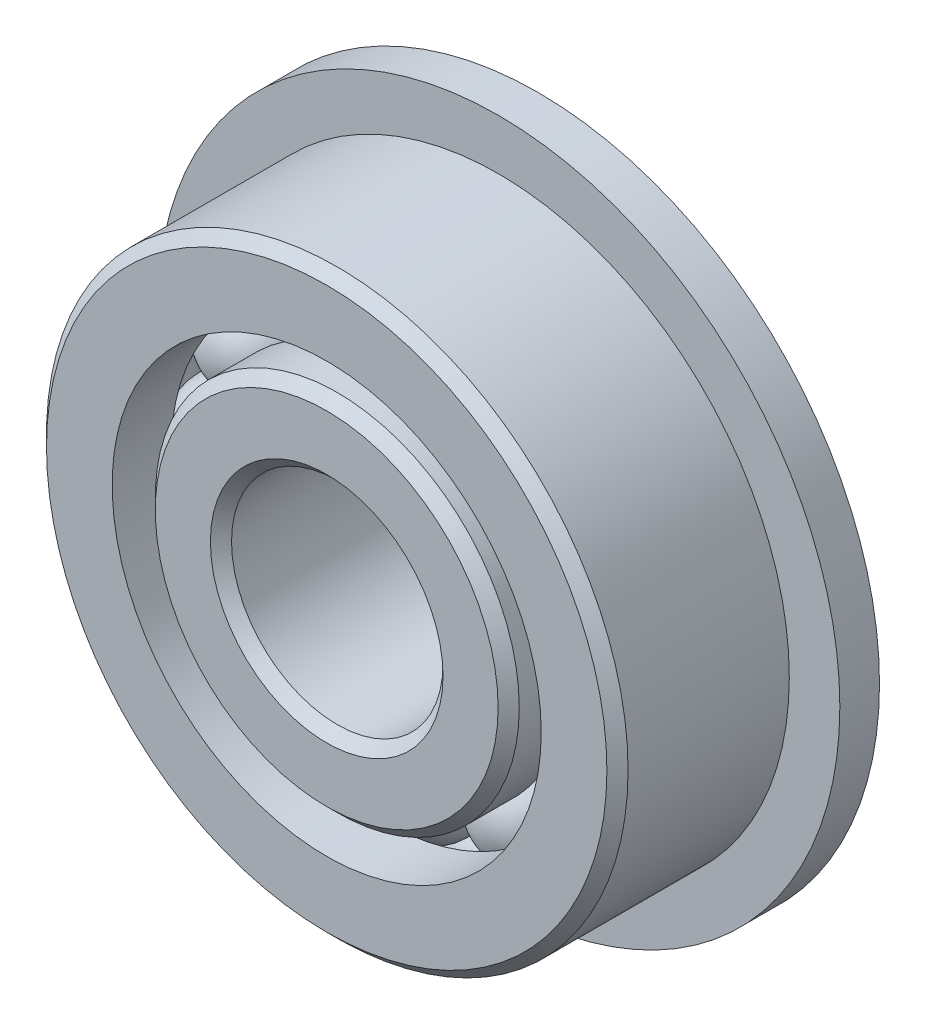
ISO-10303-21;
HEADER;
FILE_DESCRIPTION(('STEP AP214'),'2;1');
FILE_NAME('part.step','',(''),(''),'','','');
FILE_SCHEMA(('AUTOMOTIVE_DESIGN { 1 0 10303 214 1 1 1 1 }'));
ENDSEC;
DATA;
#1=APPLICATION_CONTEXT('core data for automotive mechanical design processes');
#2=APPLICATION_PROTOCOL_DEFINITION('international standard','automotive_design',2000,#1);
#3=PRODUCT_CONTEXT('',#1,'mechanical');
#4=PRODUCT('Part','Part','',(#3));
#5=PRODUCT_RELATED_PRODUCT_CATEGORY('part','',(#4));
#6=PRODUCT_DEFINITION_FORMATION('','',#4);
#7=PRODUCT_DEFINITION_CONTEXT('part definition',#1,'design');
#8=PRODUCT_DEFINITION('design','',#6,#7);
#9=PRODUCT_DEFINITION_SHAPE('','',#8);
#10=(LENGTH_UNIT() NAMED_UNIT(*) SI_UNIT(.MILLI.,.METRE.));
#11=(NAMED_UNIT(*) PLANE_ANGLE_UNIT() SI_UNIT($,.RADIAN.));
#12=(NAMED_UNIT(*) SI_UNIT($,.STERADIAN.) SOLID_ANGLE_UNIT());
#13=UNCERTAINTY_MEASURE_WITH_UNIT(LENGTH_MEASURE(1.E-05),#10,'distance_accuracy_value','');
#14=(GEOMETRIC_REPRESENTATION_CONTEXT(3) GLOBAL_UNCERTAINTY_ASSIGNED_CONTEXT((#13)) GLOBAL_UNIT_ASSIGNED_CONTEXT((#10,
#11,#12)) REPRESENTATION_CONTEXT('',''));
#15=CARTESIAN_POINT('',(0.,0.,0.));
#16=DIRECTION('',(0.,0.,1.));
#17=DIRECTION('',(1.,0.,0.));
#18=AXIS2_PLACEMENT_3D('',#15,#16,#17);
#19=CARTESIAN_POINT('',(-2.97656249999993,5.15555748190427,0.));
#20=DIRECTION('',(0.,0.,1.));
#21=DIRECTION('',(-0.499999999999989,0.866025403784445,0.));
#22=AXIS2_PLACEMENT_3D('',#19,#20,#21);
#23=SPHERICAL_SURFACE('',#22,1.4932612773582);
#24=CARTESIAN_POINT('',(-2.97656249999993,5.15555748190427,1.4932612773582));
#25=VERTEX_POINT('',#24);
#26=VERTEX_LOOP('',#25);
#27=FACE_BOUND('',#26,.T.);
#28=ADVANCED_FACE('F37',(#27),#23,.T.);
#29=CLOSED_SHELL('',(#28));
#30=MANIFOLD_SOLID_BREP('B2',#29);
#31=CARTESIAN_POINT('',(-5.1555574819042,2.97656250000006,0.));
#32=DIRECTION('',(0.,0.,1.));
#33=DIRECTION('',(-0.866025403784433,0.50000000000001,0.));
#34=AXIS2_PLACEMENT_3D('',#31,#32,#33);
#35=SPHERICAL_SURFACE('',#34,1.4932612773582);
#36=CARTESIAN_POINT('',(-5.1555574819042,2.97656250000006,1.4932612773582));
#37=VERTEX_POINT('',#36);
#38=VERTEX_LOOP('',#37);
#39=FACE_BOUND('',#38,.T.);
#40=ADVANCED_FACE('F57',(#39),#35,.T.);
#41=CLOSED_SHELL('',(#40));
#42=MANIFOLD_SOLID_BREP('B6',#41);
#43=CARTESIAN_POINT('',(-5.953125,0.,0.));
#44=DIRECTION('',(0.,0.,1.));
#45=DIRECTION('',(-1.,0.,0.));
#46=AXIS2_PLACEMENT_3D('',#43,#44,#45);
#47=SPHERICAL_SURFACE('',#46,1.4932612773582);
#48=CARTESIAN_POINT('',(-5.953125,0.,1.4932612773582));
#49=VERTEX_POINT('',#48);
#50=VERTEX_LOOP('',#49);
#51=FACE_BOUND('',#50,.T.);
#52=ADVANCED_FACE('F77',(#51),#47,.T.);
#53=CLOSED_SHELL('',(#52));
#54=MANIFOLD_SOLID_BREP('B33',#53);
#55=CARTESIAN_POINT('',(-5.15555748190426,-2.97656249999995,0.));
#56=DIRECTION('',(0.,0.,1.));
#57=DIRECTION('',(-0.866025403784443,-0.499999999999992,0.));
#58=AXIS2_PLACEMENT_3D('',#55,#56,#57);
#59=SPHERICAL_SURFACE('',#58,1.4932612773582);
#60=CARTESIAN_POINT('',(-5.15555748190426,-2.97656249999995,1.4932612773582));
#61=VERTEX_POINT('',#60);
#62=VERTEX_LOOP('',#61);
#63=FACE_BOUND('',#62,.T.);
#64=ADVANCED_FACE('F97',(#63),#59,.T.);
#65=CLOSED_SHELL('',(#64));
#66=MANIFOLD_SOLID_BREP('B53',#65);
#67=CARTESIAN_POINT('',(-2.97656250000004,-5.15555748190421,0.));
#68=DIRECTION('',(0.,0.,1.));
#69=DIRECTION('',(-0.500000000000007,-0.866025403784435,0.));
#70=AXIS2_PLACEMENT_3D('',#67,#68,#69);
#71=SPHERICAL_SURFACE('',#70,1.4932612773582);
#72=CARTESIAN_POINT('',(-2.97656250000004,-5.15555748190421,1.4932612773582));
#73=VERTEX_POINT('',#72);
#74=VERTEX_LOOP('',#73);
#75=FACE_BOUND('',#74,.T.);
#76=ADVANCED_FACE('F117',(#75),#71,.T.);
#77=CLOSED_SHELL('',(#76));
#78=MANIFOLD_SOLID_BREP('B73',#77);
#79=CARTESIAN_POINT('',(0.,-5.953125,0.));
#80=DIRECTION('',(0.,0.,1.));
#81=DIRECTION('',(0.,-1.,0.));
#82=AXIS2_PLACEMENT_3D('',#79,#80,#81);
#83=SPHERICAL_SURFACE('',#82,1.4932612773582);
#84=CARTESIAN_POINT('',(0.,-5.953125,1.4932612773582));
#85=VERTEX_POINT('',#84);
#86=VERTEX_LOOP('',#85);
#87=FACE_BOUND('',#86,.T.);
#88=ADVANCED_FACE('F137',(#87),#83,.T.);
#89=CLOSED_SHELL('',(#88));
#90=MANIFOLD_SOLID_BREP('B93',#89);
#91=CARTESIAN_POINT('',(2.97656249999997,-5.15555748190425,0.));
#92=DIRECTION('',(0.,0.,1.));
#93=DIRECTION('',(0.499999999999995,-0.866025403784442,0.));
#94=AXIS2_PLACEMENT_3D('',#91,#92,#93);
#95=SPHERICAL_SURFACE('',#94,1.4932612773582);
#96=CARTESIAN_POINT('',(2.97656249999997,-5.15555748190425,1.4932612773582));
#97=VERTEX_POINT('',#96);
#98=VERTEX_LOOP('',#97);
#99=FACE_BOUND('',#98,.T.);
#100=ADVANCED_FACE('F157',(#99),#95,.T.);
#101=CLOSED_SHELL('',(#100));
#102=MANIFOLD_SOLID_BREP('B113',#101);
#103=CARTESIAN_POINT('',(5.15555748190422,-2.97656250000002,0.));
#104=DIRECTION('',(0.,0.,1.));
#105=DIRECTION('',(0.866025403784436,-0.500000000000004,0.));
#106=AXIS2_PLACEMENT_3D('',#103,#104,#105);
#107=SPHERICAL_SURFACE('',#106,1.4932612773582);
#108=CARTESIAN_POINT('',(5.15555748190422,-2.97656250000002,1.4932612773582));
#109=VERTEX_POINT('',#108);
#110=VERTEX_LOOP('',#109);
#111=FACE_BOUND('',#110,.T.);
#112=ADVANCED_FACE('F177',(#111),#107,.T.);
#113=CLOSED_SHELL('',(#112));
#114=MANIFOLD_SOLID_BREP('B133',#113);
#115=CARTESIAN_POINT('',(5.953125,0.,0.));
#116=DIRECTION('',(0.,0.,1.));
#117=DIRECTION('',(1.,0.,0.));
#118=AXIS2_PLACEMENT_3D('',#115,#116,#117);
#119=SPHERICAL_SURFACE('',#118,1.4932612773582);
#120=CARTESIAN_POINT('',(5.953125,0.,1.4932612773582));
#121=VERTEX_POINT('',#120);
#122=VERTEX_LOOP('',#121);
#123=FACE_BOUND('',#122,.T.);
#124=ADVANCED_FACE('F197',(#123),#119,.T.);
#125=CLOSED_SHELL('',(#124));
#126=MANIFOLD_SOLID_BREP('B153',#125);
#127=CARTESIAN_POINT('',(5.15555748190424,2.97656249999999,0.));
#128=DIRECTION('',(0.,0.,1.));
#129=DIRECTION('',(0.86602540378444,0.499999999999998,0.));
#130=AXIS2_PLACEMENT_3D('',#127,#128,#129);
#131=SPHERICAL_SURFACE('',#130,1.4932612773582);
#132=CARTESIAN_POINT('',(5.15555748190424,2.97656249999999,1.4932612773582));
#133=VERTEX_POINT('',#132);
#134=VERTEX_LOOP('',#133);
#135=FACE_BOUND('',#134,.T.);
#136=ADVANCED_FACE('F217',(#135),#131,.T.);
#137=CLOSED_SHELL('',(#136));
#138=MANIFOLD_SOLID_BREP('B173',#137);
#139=CARTESIAN_POINT('',(2.97656250000001,5.15555748190423,0.));
#140=DIRECTION('',(0.,0.,1.));
#141=DIRECTION('',(0.500000000000001,0.866025403784438,0.));
#142=AXIS2_PLACEMENT_3D('',#139,#140,#141);
#143=SPHERICAL_SURFACE('',#142,1.4932612773582);
#144=CARTESIAN_POINT('',(2.97656250000001,5.15555748190423,1.4932612773582));
#145=VERTEX_POINT('',#144);
#146=VERTEX_LOOP('',#145);
#147=FACE_BOUND('',#146,.T.);
#148=ADVANCED_FACE('F237',(#147),#143,.T.);
#149=CLOSED_SHELL('',(#148));
#150=MANIFOLD_SOLID_BREP('B193',#149);
#151=CARTESIAN_POINT('',(0.,5.953125,0.));
#152=DIRECTION('',(0.,0.,1.));
#153=DIRECTION('',(0.,1.,0.));
#154=AXIS2_PLACEMENT_3D('',#151,#152,#153);
#155=SPHERICAL_SURFACE('',#154,1.4932612773582);
#156=CARTESIAN_POINT('',(0.,5.953125,1.4932612773582));
#157=VERTEX_POINT('',#156);
#158=VERTEX_LOOP('',#157);
#159=FACE_BOUND('',#158,.T.);
#160=ADVANCED_FACE('F259',(#159),#155,.T.);
#161=CLOSED_SHELL('',(#160));
#162=MANIFOLD_SOLID_BREP('B213',#161);
#163=CARTESIAN_POINT('',(0.,0.,2.8575));
#164=DIRECTION('',(0.,0.,-1.));
#165=DIRECTION('',(-1.,0.,0.));
#166=AXIS2_PLACEMENT_3D('',#163,#164,#165);
#167=CONICAL_SURFACE('',#166,5.46466346153846,0.785398163397448);
#168=CARTESIAN_POINT('',(0.,0.,3.175));
#169=DIRECTION('',(0.,0.,1.));
#170=DIRECTION('',(1.,0.,0.));
#171=AXIS2_PLACEMENT_3D('',#168,#169,#170);
#172=CIRCLE('',#171,5.14716346153846);
#173=CARTESIAN_POINT('',(5.14716346153846,0.,3.175));
#174=VERTEX_POINT('',#173);
#175=EDGE_CURVE('E312',#174,#174,#172,.T.);
#176=ORIENTED_EDGE('',*,*,#175,.F.);
#177=EDGE_LOOP('',(#176));
#178=FACE_BOUND('',#177,.T.);
#179=CARTESIAN_POINT('',(0.,0.,2.8575));
#180=DIRECTION('',(0.,0.,1.));
#181=DIRECTION('',(1.,0.,0.));
#182=AXIS2_PLACEMENT_3D('',#179,#180,#181);
#183=CIRCLE('',#182,5.46466346153846);
#184=CARTESIAN_POINT('',(5.46466346153846,0.,2.8575));
#185=VERTEX_POINT('',#184);
#186=EDGE_CURVE('E258',#185,#185,#183,.T.);
#187=ORIENTED_EDGE('',*,*,#186,.T.);
#188=EDGE_LOOP('',(#187));
#189=FACE_BOUND('',#188,.T.);
#190=ADVANCED_FACE('F278',(#178,#189),#167,.T.);
#191=CARTESIAN_POINT('',(0.,0.,3.175));
#192=DIRECTION('',(0.,0.,1.));
#193=DIRECTION('',(1.,0.,0.));
#194=AXIS2_PLACEMENT_3D('',#191,#192,#193);
#195=CYLINDRICAL_SURFACE('',#194,5.46466346153846);
#196=ORIENTED_EDGE('',*,*,#186,.F.);
#197=EDGE_LOOP('',(#196));
#198=FACE_BOUND('',#197,.T.);
#199=CARTESIAN_POINT('',(0.,0.,1.41111111111111));
#200=DIRECTION('',(0.,0.,1.));
#201=DIRECTION('',(1.,0.,0.));
#202=AXIS2_PLACEMENT_3D('',#199,#200,#201);
#203=CIRCLE('',#202,5.46466346153846);
#204=CARTESIAN_POINT('',(5.46466346153846,0.,1.41111111111111));
#205=VERTEX_POINT('',#204);
#206=EDGE_CURVE('E284',#205,#205,#203,.T.);
#207=ORIENTED_EDGE('',*,*,#206,.T.);
#208=EDGE_LOOP('',(#207));
#209=FACE_BOUND('',#208,.T.);
#210=ADVANCED_FACE('F319',(#198,#209),#195,.T.);
#211=CARTESIAN_POINT('',(0.,0.,0.));
#212=DIRECTION('',(0.,0.,1.));
#213=DIRECTION('',(1.,0.,0.));
#214=AXIS2_PLACEMENT_3D('',#211,#212,#213);
#215=TOROIDAL_SURFACE('',#214,5.953125,1.4932612773582);
#216=ORIENTED_EDGE('',*,*,#206,.F.);
#217=EDGE_LOOP('',(#216));
#218=FACE_BOUND('',#217,.T.);
#219=CARTESIAN_POINT('',(0.,0.,-1.41111111111111));
#220=DIRECTION('',(0.,0.,1.));
#221=DIRECTION('',(1.,0.,0.));
#222=AXIS2_PLACEMENT_3D('',#219,#220,#221);
#223=CIRCLE('',#222,5.46466346153846);
#224=CARTESIAN_POINT('',(5.46466346153846,0.,-1.41111111111111));
#225=VERTEX_POINT('',#224);
#226=EDGE_CURVE('E288',#225,#225,#223,.T.);
#227=ORIENTED_EDGE('',*,*,#226,.T.);
#228=EDGE_LOOP('',(#227));
#229=FACE_BOUND('',#228,.T.);
#230=ADVANCED_FACE('F323',(#218,#229),#215,.F.);
#231=CARTESIAN_POINT('',(0.,0.,3.175));
#232=DIRECTION('',(0.,0.,1.));
#233=DIRECTION('',(1.,0.,0.));
#234=AXIS2_PLACEMENT_3D('',#231,#232,#233);
#235=CYLINDRICAL_SURFACE('',#234,5.46466346153846);
#236=ORIENTED_EDGE('',*,*,#226,.F.);
#237=EDGE_LOOP('',(#236));
#238=FACE_BOUND('',#237,.T.);
#239=CARTESIAN_POINT('',(0.,0.,-4.445));
#240=DIRECTION('',(0.,0.,1.));
#241=DIRECTION('',(1.,0.,0.));
#242=AXIS2_PLACEMENT_3D('',#239,#240,#241);
#243=CIRCLE('',#242,5.46466346153846);
#244=CARTESIAN_POINT('',(5.46466346153846,0.,-4.445));
#245=VERTEX_POINT('',#244);
#246=EDGE_CURVE('E292',#245,#245,#243,.T.);
#247=ORIENTED_EDGE('',*,*,#246,.T.);
#248=EDGE_LOOP('',(#247));
#249=FACE_BOUND('',#248,.T.);
#250=ADVANCED_FACE('F328',(#238,#249),#235,.T.);
#251=CARTESIAN_POINT('',(0.,0.,-4.7625));
#252=DIRECTION('',(0.,0.,1.));
#253=DIRECTION('',(1.,0.,0.));
#254=AXIS2_PLACEMENT_3D('',#251,#252,#253);
#255=CONICAL_SURFACE('',#254,5.14716346153846,0.785398163397442);
#256=ORIENTED_EDGE('',*,*,#246,.F.);
#257=EDGE_LOOP('',(#256));
#258=FACE_BOUND('',#257,.T.);
#259=CARTESIAN_POINT('',(0.,0.,-4.7625));
#260=DIRECTION('',(0.,0.,1.));
#261=DIRECTION('',(1.,0.,0.));
#262=AXIS2_PLACEMENT_3D('',#259,#260,#261);
#263=CIRCLE('',#262,5.14716346153846);
#264=CARTESIAN_POINT('',(5.14716346153846,0.,-4.7625));
#265=VERTEX_POINT('',#264);
#266=EDGE_CURVE('E297',#265,#265,#263,.T.);
#267=ORIENTED_EDGE('',*,*,#266,.T.);
#268=EDGE_LOOP('',(#267));
#269=FACE_BOUND('',#268,.T.);
#270=ADVANCED_FACE('F334',(#258,#269),#255,.T.);
#271=CARTESIAN_POINT('',(0.,5.14716346153846,-4.7625));
#272=DIRECTION('',(0.,0.,1.));
#273=DIRECTION('',(1.,0.,0.));
#274=AXIS2_PLACEMENT_3D('',#271,#272,#273);
#275=PLANE('',#274);
#276=ORIENTED_EDGE('',*,*,#266,.F.);
#277=EDGE_LOOP('',(#276));
#278=FACE_BOUND('',#277,.T.);
#279=CARTESIAN_POINT('',(0.,0.,-4.7625));
#280=DIRECTION('',(0.,0.,1.));
#281=DIRECTION('',(1.,0.,0.));
#282=AXIS2_PLACEMENT_3D('',#279,#280,#281);
#283=CIRCLE('',#282,3.4925);
#284=CARTESIAN_POINT('',(3.4925,0.,-4.7625));
#285=VERTEX_POINT('',#284);
#286=EDGE_CURVE('E300',#285,#285,#283,.T.);
#287=ORIENTED_EDGE('',*,*,#286,.T.);
#288=EDGE_LOOP('',(#287));
#289=FACE_BOUND('',#288,.T.);
#290=ADVANCED_FACE('F338',(#278,#289),#275,.F.);
#291=CARTESIAN_POINT('',(0.,0.,-4.445));
#292=DIRECTION('',(0.,0.,-1.));
#293=DIRECTION('',(-1.,0.,0.));
#294=AXIS2_PLACEMENT_3D('',#291,#292,#293);
#295=CONICAL_SURFACE('',#294,3.175,0.785398163397445);
#296=ORIENTED_EDGE('',*,*,#286,.F.);
#297=EDGE_LOOP('',(#296));
#298=FACE_BOUND('',#297,.T.);
#299=CARTESIAN_POINT('',(0.,0.,-4.445));
#300=DIRECTION('',(0.,0.,1.));
#301=DIRECTION('',(1.,0.,0.));
#302=AXIS2_PLACEMENT_3D('',#299,#300,#301);
#303=CIRCLE('',#302,3.175);
#304=CARTESIAN_POINT('',(3.175,0.,-4.445));
#305=VERTEX_POINT('',#304);
#306=EDGE_CURVE('E303',#305,#305,#303,.T.);
#307=ORIENTED_EDGE('',*,*,#306,.T.);
#308=EDGE_LOOP('',(#307));
#309=FACE_BOUND('',#308,.T.);
#310=ADVANCED_FACE('F342',(#298,#309),#295,.F.);
#311=CARTESIAN_POINT('',(0.,0.,3.175));
#312=DIRECTION('',(0.,0.,1.));
#313=DIRECTION('',(1.,0.,0.));
#314=AXIS2_PLACEMENT_3D('',#311,#312,#313);
#315=CYLINDRICAL_SURFACE('',#314,3.175);
#316=ORIENTED_EDGE('',*,*,#306,.F.);
#317=EDGE_LOOP('',(#316));
#318=FACE_BOUND('',#317,.T.);
#319=CARTESIAN_POINT('',(0.,0.,2.8575));
#320=DIRECTION('',(0.,0.,1.));
#321=DIRECTION('',(1.,0.,0.));
#322=AXIS2_PLACEMENT_3D('',#319,#320,#321);
#323=CIRCLE('',#322,3.175);
#324=CARTESIAN_POINT('',(3.175,0.,2.8575));
#325=VERTEX_POINT('',#324);
#326=EDGE_CURVE('E306',#325,#325,#323,.T.);
#327=ORIENTED_EDGE('',*,*,#326,.T.);
#328=EDGE_LOOP('',(#327));
#329=FACE_BOUND('',#328,.T.);
#330=ADVANCED_FACE('F346',(#318,#329),#315,.F.);
#331=CARTESIAN_POINT('',(0.,0.,3.175));
#332=DIRECTION('',(0.,0.,1.));
#333=DIRECTION('',(1.,0.,0.));
#334=AXIS2_PLACEMENT_3D('',#331,#332,#333);
#335=CONICAL_SURFACE('',#334,3.4925,0.785398163397448);
#336=ORIENTED_EDGE('',*,*,#326,.F.);
#337=EDGE_LOOP('',(#336));
#338=FACE_BOUND('',#337,.T.);
#339=CARTESIAN_POINT('',(0.,0.,3.175));
#340=DIRECTION('',(0.,0.,1.));
#341=DIRECTION('',(1.,0.,0.));
#342=AXIS2_PLACEMENT_3D('',#339,#340,#341);
#343=CIRCLE('',#342,3.4925);
#344=CARTESIAN_POINT('',(3.4925,0.,3.175));
#345=VERTEX_POINT('',#344);
#346=EDGE_CURVE('E309',#345,#345,#343,.T.);
#347=ORIENTED_EDGE('',*,*,#346,.T.);
#348=EDGE_LOOP('',(#347));
#349=FACE_BOUND('',#348,.T.);
#350=ADVANCED_FACE('F350',(#338,#349),#335,.F.);
#351=CARTESIAN_POINT('',(0.,3.4925,3.175));
#352=DIRECTION('',(0.,0.,-1.));
#353=DIRECTION('',(-1.,0.,0.));
#354=AXIS2_PLACEMENT_3D('',#351,#352,#353);
#355=PLANE('',#354);
#356=ORIENTED_EDGE('',*,*,#346,.F.);
#357=EDGE_LOOP('',(#356));
#358=FACE_BOUND('',#357,.T.);
#359=ORIENTED_EDGE('',*,*,#175,.T.);
#360=EDGE_LOOP('',(#359));
#361=FACE_BOUND('',#360,.T.);
#362=ADVANCED_FACE('F316',(#358,#361),#355,.F.);
#363=CLOSED_SHELL('',(#190,#210,#230,#250,#270,#290,#310,#330,#350,#362));
#364=MANIFOLD_SOLID_BREP('B233',#363);
#365=CARTESIAN_POINT('',(0.,0.,2.8575));
#366=DIRECTION('',(0.,0.,-1.));
#367=DIRECTION('',(-1.,0.,0.));
#368=AXIS2_PLACEMENT_3D('',#365,#366,#367);
#369=CONICAL_SURFACE('',#368,8.73125,0.785398163397446);
#370=CARTESIAN_POINT('',(0.,0.,3.175));
#371=DIRECTION('',(0.,0.,1.));
#372=DIRECTION('',(1.,0.,0.));
#373=AXIS2_PLACEMENT_3D('',#370,#371,#372);
#374=CIRCLE('',#373,8.41375);
#375=CARTESIAN_POINT('',(8.41375,0.,3.175));
#376=VERTEX_POINT('',#375);
#377=EDGE_CURVE('E451',#376,#376,#374,.T.);
#378=ORIENTED_EDGE('',*,*,#377,.F.);
#379=EDGE_LOOP('',(#378));
#380=FACE_BOUND('',#379,.T.);
#381=CARTESIAN_POINT('',(0.,0.,2.8575));
#382=DIRECTION('',(0.,0.,1.));
#383=DIRECTION('',(1.,0.,0.));
#384=AXIS2_PLACEMENT_3D('',#381,#382,#383);
#385=CIRCLE('',#384,8.73125);
#386=CARTESIAN_POINT('',(8.73125,0.,2.8575));
#387=VERTEX_POINT('',#386);
#388=EDGE_CURVE('E277',#387,#387,#385,.T.);
#389=ORIENTED_EDGE('',*,*,#388,.T.);
#390=EDGE_LOOP('',(#389));
#391=FACE_BOUND('',#390,.T.);
#392=ADVANCED_FACE('F429',(#380,#391),#369,.T.);
#393=CARTESIAN_POINT('',(0.,0.,3.175));
#394=DIRECTION('',(0.,0.,1.));
#395=DIRECTION('',(1.,0.,0.));
#396=AXIS2_PLACEMENT_3D('',#393,#394,#395);
#397=CYLINDRICAL_SURFACE('',#396,8.73125);
#398=CARTESIAN_POINT('',(0.,0.,-1.984375));
#399=DIRECTION('',(0.,0.,1.));
#400=DIRECTION('',(1.,0.,0.));
#401=AXIS2_PLACEMENT_3D('',#398,#399,#400);
#402=CIRCLE('',#401,8.73125);
#403=CARTESIAN_POINT('',(8.73125,0.,-1.984375));
#404=VERTEX_POINT('',#403);
#405=EDGE_CURVE('E454',#404,#404,#402,.T.);
#406=ORIENTED_EDGE('',*,*,#405,.T.);
#407=EDGE_LOOP('',(#406));
#408=FACE_BOUND('',#407,.T.);
#409=ORIENTED_EDGE('',*,*,#388,.F.);
#410=EDGE_LOOP('',(#409));
#411=FACE_BOUND('',#410,.T.);
#412=ADVANCED_FACE('F474',(#408,#411),#397,.T.);
#413=CARTESIAN_POINT('',(0.,8.41375,-3.175));
#414=DIRECTION('',(0.,0.,1.));
#415=DIRECTION('',(1.,0.,0.));
#416=AXIS2_PLACEMENT_3D('',#413,#414,#415);
#417=PLANE('',#416);
#418=CARTESIAN_POINT('',(0.,0.,-3.175));
#419=DIRECTION('',(0.,0.,1.));
#420=DIRECTION('',(1.,0.,0.));
#421=AXIS2_PLACEMENT_3D('',#418,#419,#420);
#422=CIRCLE('',#421,6.44158653846154);
#423=CARTESIAN_POINT('',(6.44158653846154,0.,-3.175));
#424=VERTEX_POINT('',#423);
#425=EDGE_CURVE('E435',#424,#424,#422,.T.);
#426=ORIENTED_EDGE('',*,*,#425,.T.);
#427=EDGE_LOOP('',(#426));
#428=FACE_BOUND('',#427,.T.);
#429=CARTESIAN_POINT('',(0.,0.,-3.175));
#430=DIRECTION('',(0.,0.,-1.));
#431=DIRECTION('',(-1.,0.,0.));
#432=AXIS2_PLACEMENT_3D('',#429,#430,#431);
#433=CIRCLE('',#432,10.2489);
#434=CARTESIAN_POINT('',(-10.2489,0.,-3.175));
#435=VERTEX_POINT('',#434);
#436=EDGE_CURVE('E457',#435,#435,#433,.T.);
#437=ORIENTED_EDGE('',*,*,#436,.T.);
#438=EDGE_LOOP('',(#437));
#439=FACE_BOUND('',#438,.T.);
#440=ADVANCED_FACE('F477',(#428,#439),#417,.F.);
#441=CARTESIAN_POINT('',(0.,0.,3.175));
#442=DIRECTION('',(0.,0.,1.));
#443=DIRECTION('',(1.,0.,0.));
#444=AXIS2_PLACEMENT_3D('',#441,#442,#443);
#445=CYLINDRICAL_SURFACE('',#444,6.44158653846154);
#446=CARTESIAN_POINT('',(0.,0.,-1.41111111111111));
#447=DIRECTION('',(0.,0.,1.));
#448=DIRECTION('',(1.,0.,0.));
#449=AXIS2_PLACEMENT_3D('',#446,#447,#448);
#450=CIRCLE('',#449,6.44158653846154);
#451=CARTESIAN_POINT('',(6.44158653846154,0.,-1.41111111111111));
#452=VERTEX_POINT('',#451);
#453=EDGE_CURVE('E439',#452,#452,#450,.T.);
#454=ORIENTED_EDGE('',*,*,#453,.T.);
#455=EDGE_LOOP('',(#454));
#456=FACE_BOUND('',#455,.T.);
#457=ORIENTED_EDGE('',*,*,#425,.F.);
#458=EDGE_LOOP('',(#457));
#459=FACE_BOUND('',#458,.T.);
#460=ADVANCED_FACE('F482',(#456,#459),#445,.F.);
#461=CARTESIAN_POINT('',(0.,0.,0.));
#462=DIRECTION('',(0.,0.,1.));
#463=DIRECTION('',(1.,0.,0.));
#464=AXIS2_PLACEMENT_3D('',#461,#462,#463);
#465=TOROIDAL_SURFACE('',#464,5.953125,1.4932612773582);
#466=ORIENTED_EDGE('',*,*,#453,.F.);
#467=EDGE_LOOP('',(#466));
#468=FACE_BOUND('',#467,.T.);
#469=CARTESIAN_POINT('',(0.,0.,1.41111111111111));
#470=DIRECTION('',(0.,0.,1.));
#471=DIRECTION('',(1.,0.,0.));
#472=AXIS2_PLACEMENT_3D('',#469,#470,#471);
#473=CIRCLE('',#472,6.44158653846154);
#474=CARTESIAN_POINT('',(6.44158653846154,0.,1.41111111111111));
#475=VERTEX_POINT('',#474);
#476=EDGE_CURVE('E443',#475,#475,#473,.T.);
#477=ORIENTED_EDGE('',*,*,#476,.T.);
#478=EDGE_LOOP('',(#477));
#479=FACE_BOUND('',#478,.T.);
#480=ADVANCED_FACE('F488',(#468,#479),#465,.F.);
#481=CARTESIAN_POINT('',(0.,0.,3.175));
#482=DIRECTION('',(0.,0.,1.));
#483=DIRECTION('',(1.,0.,0.));
#484=AXIS2_PLACEMENT_3D('',#481,#482,#483);
#485=CYLINDRICAL_SURFACE('',#484,6.44158653846154);
#486=ORIENTED_EDGE('',*,*,#476,.F.);
#487=EDGE_LOOP('',(#486));
#488=FACE_BOUND('',#487,.T.);
#489=CARTESIAN_POINT('',(0.,0.,3.175));
#490=DIRECTION('',(0.,0.,1.));
#491=DIRECTION('',(1.,0.,0.));
#492=AXIS2_PLACEMENT_3D('',#489,#490,#491);
#493=CIRCLE('',#492,6.44158653846154);
#494=CARTESIAN_POINT('',(6.44158653846154,0.,3.175));
#495=VERTEX_POINT('',#494);
#496=EDGE_CURVE('E448',#495,#495,#493,.T.);
#497=ORIENTED_EDGE('',*,*,#496,.T.);
#498=EDGE_LOOP('',(#497));
#499=FACE_BOUND('',#498,.T.);
#500=ADVANCED_FACE('F492',(#488,#499),#485,.F.);
#501=CARTESIAN_POINT('',(0.,8.41375,3.175));
#502=DIRECTION('',(0.,0.,-1.));
#503=DIRECTION('',(-1.,0.,0.));
#504=AXIS2_PLACEMENT_3D('',#501,#502,#503);
#505=PLANE('',#504);
#506=ORIENTED_EDGE('',*,*,#496,.F.);
#507=EDGE_LOOP('',(#506));
#508=FACE_BOUND('',#507,.T.);
#509=ORIENTED_EDGE('',*,*,#377,.T.);
#510=EDGE_LOOP('',(#509));
#511=FACE_BOUND('',#510,.T.);
#512=ADVANCED_FACE('F470',(#508,#511),#505,.F.);
#513=CARTESIAN_POINT('',(0.,6.44158653846154,-1.984375));
#514=DIRECTION('',(0.,0.,1.));
#515=DIRECTION('',(1.,0.,0.));
#516=AXIS2_PLACEMENT_3D('',#513,#514,#515);
#517=PLANE('',#516);
#518=CARTESIAN_POINT('',(0.,0.,-1.984375));
#519=DIRECTION('',(0.,0.,-1.));
#520=DIRECTION('',(-1.,0.,0.));
#521=AXIS2_PLACEMENT_3D('',#518,#519,#520);
#522=CIRCLE('',#521,10.2489);
#523=CARTESIAN_POINT('',(-10.2489,0.,-1.984375));
#524=VERTEX_POINT('',#523);
#525=EDGE_CURVE('E460',#524,#524,#522,.T.);
#526=ORIENTED_EDGE('',*,*,#525,.F.);
#527=EDGE_LOOP('',(#526));
#528=FACE_BOUND('',#527,.T.);
#529=ORIENTED_EDGE('',*,*,#405,.F.);
#530=EDGE_LOOP('',(#529));
#531=FACE_BOUND('',#530,.T.);
#532=ADVANCED_FACE('F467',(#528,#531),#517,.T.);
#533=CARTESIAN_POINT('',(0.,0.,-3.175));
#534=DIRECTION('',(0.,0.,-1.));
#535=DIRECTION('',(-1.,0.,0.));
#536=AXIS2_PLACEMENT_3D('',#533,#534,#535);
#537=CYLINDRICAL_SURFACE('',#536,10.2489);
#538=ORIENTED_EDGE('',*,*,#525,.T.);
#539=EDGE_LOOP('',(#538));
#540=FACE_BOUND('',#539,.T.);
#541=ORIENTED_EDGE('',*,*,#436,.F.);
#542=EDGE_LOOP('',(#541));
#543=FACE_BOUND('',#542,.T.);
#544=ADVANCED_FACE('F464',(#540,#543),#537,.T.);
#545=CLOSED_SHELL('',(#392,#412,#440,#460,#480,#500,#512,#532,#544));
#546=MANIFOLD_SOLID_BREP('B253',#545);
#547=ADVANCED_BREP_SHAPE_REPRESENTATION('',(#18,#30,#42,#54,#66,#78,#90,#102,#114,#126,#138,
#150,#162,#364,#546),#14);
#548=SHAPE_DEFINITION_REPRESENTATION(#9,#547);
ENDSEC;
END-ISO-10303-21;
